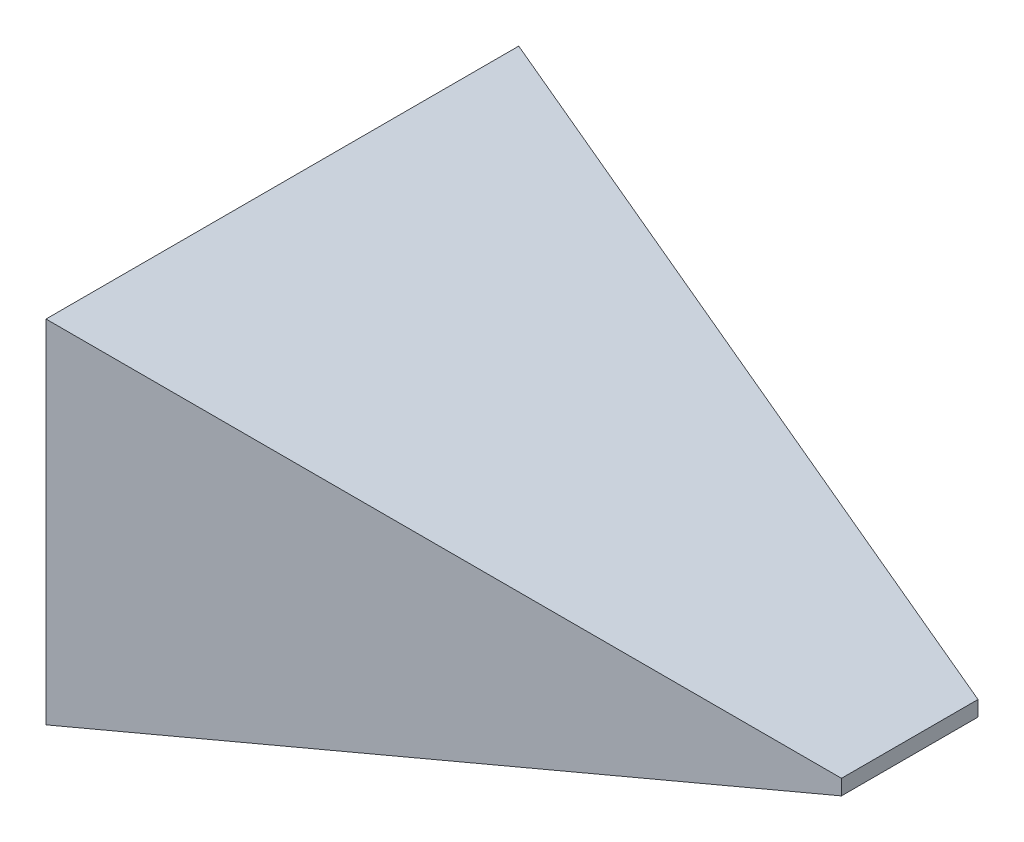
ISO-10303-21;
HEADER;
FILE_DESCRIPTION(('STEP AP214'),'2;1');
FILE_NAME('part.step','',(''),(''),'','','');
FILE_SCHEMA(('AUTOMOTIVE_DESIGN { 1 0 10303 214 1 1 1 1 }'));
ENDSEC;
DATA;
#1=APPLICATION_CONTEXT('core data for automotive mechanical design processes');
#2=APPLICATION_PROTOCOL_DEFINITION('international standard','automotive_design',2000,#1);
#3=PRODUCT_CONTEXT('',#1,'mechanical');
#4=PRODUCT('Part','Part','',(#3));
#5=PRODUCT_RELATED_PRODUCT_CATEGORY('part','',(#4));
#6=PRODUCT_DEFINITION_FORMATION('','',#4);
#7=PRODUCT_DEFINITION_CONTEXT('part definition',#1,'design');
#8=PRODUCT_DEFINITION('design','',#6,#7);
#9=PRODUCT_DEFINITION_SHAPE('','',#8);
#10=(LENGTH_UNIT() NAMED_UNIT(*) SI_UNIT(.MILLI.,.METRE.));
#11=(NAMED_UNIT(*) PLANE_ANGLE_UNIT() SI_UNIT($,.RADIAN.));
#12=(NAMED_UNIT(*) SI_UNIT($,.STERADIAN.) SOLID_ANGLE_UNIT());
#13=UNCERTAINTY_MEASURE_WITH_UNIT(LENGTH_MEASURE(1.E-05),#10,'distance_accuracy_value','');
#14=(GEOMETRIC_REPRESENTATION_CONTEXT(3) GLOBAL_UNCERTAINTY_ASSIGNED_CONTEXT((#13)) GLOBAL_UNIT_ASSIGNED_CONTEXT((#10,
#11,#12)) REPRESENTATION_CONTEXT('',''));
#15=CARTESIAN_POINT('',(0.,0.,0.));
#16=DIRECTION('',(0.,0.,1.));
#17=DIRECTION('',(1.,0.,0.));
#18=AXIS2_PLACEMENT_3D('',#15,#16,#17);
#19=CARTESIAN_POINT('',(0.,-25.4,-34.163));
#20=DIRECTION('',(0.258819045102521,0.,-0.965925826289068));
#21=DIRECTION('',(-0.965925826289068,0.,-0.258819045102521));
#22=AXIS2_PLACEMENT_3D('',#19,#20,#21);
#23=PLANE('',#22);
#24=DIRECTION('',(0.,1.,0.));
#25=VECTOR('',#24,1.);
#26=CARTESIAN_POINT('',(0.,-25.4,-34.163));
#27=LINE('',#26,#25);
#28=CARTESIAN_POINT('',(0.,-25.4,-34.163));
#29=VERTEX_POINT('',#28);
#30=CARTESIAN_POINT('',(0.,25.4,-34.163));
#31=VERTEX_POINT('',#30);
#32=EDGE_CURVE('E79',#29,#31,#27,.T.);
#33=ORIENTED_EDGE('',*,*,#32,.T.);
#34=DIRECTION('',(-0.935113126531029,0.250562807085732,-0.250562807085732));
#35=VECTOR('',#34,1.);
#36=CARTESIAN_POINT('',(16.0090940447864,21.1103761791456,-29.8733761791456));
#37=LINE('',#36,#35);
#38=CARTESIAN_POINT('',(90.6780000000001,1.10290312873057,-9.86590312873057));
#39=VERTEX_POINT('',#38);
#40=EDGE_CURVE('E11',#39,#31,#37,.T.);
#41=ORIENTED_EDGE('',*,*,#40,.F.);
#42=DIRECTION('',(0.,-1.,0.));
#43=VECTOR('',#42,1.);
#44=CARTESIAN_POINT('',(90.6780000000001,0.,-9.86590312873057));
#45=LINE('',#44,#43);
#46=CARTESIAN_POINT('',(90.6780000000001,-1.10290312873057,-9.86590312873057));
#47=VERTEX_POINT('',#46);
#48=EDGE_CURVE('E95',#47,#39,#45,.F.);
#49=ORIENTED_EDGE('',*,*,#48,.F.);
#50=DIRECTION('',(-0.935113126531029,-0.250562807085732,-0.250562807085732));
#51=VECTOR('',#50,1.);
#52=CARTESIAN_POINT('',(0.,-25.4,-34.163));
#53=LINE('',#52,#51);
#54=EDGE_CURVE('E90',#47,#29,#53,.T.);
#55=ORIENTED_EDGE('',*,*,#54,.T.);
#56=EDGE_LOOP('',(#33,#41,#49,#55));
#57=FACE_BOUND('',#56,.T.);
#58=ADVANCED_FACE('F33',(#57),#23,.T.);
#59=CARTESIAN_POINT('',(0.,25.4,34.163));
#60=DIRECTION('',(0.258819045102521,0.965925826289068,0.));
#61=DIRECTION('',(-0.965925826289068,0.258819045102521,0.));
#62=AXIS2_PLACEMENT_3D('',#59,#60,#61);
#63=PLANE('',#62);
#64=DIRECTION('',(0.,0.,1.));
#65=VECTOR('',#64,1.);
#66=CARTESIAN_POINT('',(0.,25.4,34.163));
#67=LINE('',#66,#65);
#68=CARTESIAN_POINT('',(0.,25.4,34.163));
#69=VERTEX_POINT('',#68);
#70=EDGE_CURVE('E75',#31,#69,#67,.T.);
#71=ORIENTED_EDGE('',*,*,#70,.T.);
#72=DIRECTION('',(-0.935113126531029,0.250562807085732,0.250562807085732));
#73=VECTOR('',#72,1.);
#74=CARTESIAN_POINT('',(11.9026721522576,22.2106886090302,30.9736886090302));
#75=LINE('',#74,#73);
#76=CARTESIAN_POINT('',(90.6780000000001,1.10290312873057,9.86590312873057));
#77=VERTEX_POINT('',#76);
#78=EDGE_CURVE('E42',#77,#69,#75,.T.);
#79=ORIENTED_EDGE('',*,*,#78,.F.);
#80=DIRECTION('',(0.,0.,-1.));
#81=VECTOR('',#80,1.);
#82=CARTESIAN_POINT('',(90.6780000000001,1.10290312873057,0.));
#83=LINE('',#82,#81);
#84=EDGE_CURVE('E86',#39,#77,#83,.F.);
#85=ORIENTED_EDGE('',*,*,#84,.F.);
#86=ORIENTED_EDGE('',*,*,#40,.T.);
#87=EDGE_LOOP('',(#71,#79,#85,#86));
#88=FACE_BOUND('',#87,.T.);
#89=ADVANCED_FACE('F35',(#88),#63,.T.);
#90=CARTESIAN_POINT('',(0.,-25.4,34.163));
#91=DIRECTION('',(0.258819045102521,0.,0.965925826289068));
#92=DIRECTION('',(0.965925826289068,0.,-0.258819045102521));
#93=AXIS2_PLACEMENT_3D('',#90,#91,#92);
#94=PLANE('',#93);
#95=DIRECTION('',(0.,-1.,0.));
#96=VECTOR('',#95,1.);
#97=CARTESIAN_POINT('',(0.,-25.4,34.163));
#98=LINE('',#97,#96);
#99=CARTESIAN_POINT('',(0.,-25.4,34.163));
#100=VERTEX_POINT('',#99);
#101=EDGE_CURVE('E80',#69,#100,#98,.T.);
#102=ORIENTED_EDGE('',*,*,#101,.T.);
#103=DIRECTION('',(-0.935113126531029,-0.250562807085732,0.250562807085732));
#104=VECTOR('',#103,1.);
#105=CARTESIAN_POINT('',(0.,-25.4,34.163));
#106=LINE('',#105,#104);
#107=CARTESIAN_POINT('',(90.6780000000001,-1.10290312873057,9.86590312873057));
#108=VERTEX_POINT('',#107);
#109=EDGE_CURVE('E98',#108,#100,#106,.T.);
#110=ORIENTED_EDGE('',*,*,#109,.F.);
#111=DIRECTION('',(0.,1.,0.));
#112=VECTOR('',#111,1.);
#113=CARTESIAN_POINT('',(90.6780000000001,0.,9.86590312873057));
#114=LINE('',#113,#112);
#115=EDGE_CURVE('E54',#77,#108,#114,.F.);
#116=ORIENTED_EDGE('',*,*,#115,.F.);
#117=ORIENTED_EDGE('',*,*,#78,.T.);
#118=EDGE_LOOP('',(#102,#110,#116,#117));
#119=FACE_BOUND('',#118,.T.);
#120=ADVANCED_FACE('F105',(#119),#94,.T.);
#121=CARTESIAN_POINT('',(0.,-25.4,34.163));
#122=DIRECTION('',(0.258819045102521,-0.965925826289068,0.));
#123=DIRECTION('',(0.965925826289068,0.258819045102521,0.));
#124=AXIS2_PLACEMENT_3D('',#121,#122,#123);
#125=PLANE('',#124);
#126=DIRECTION('',(0.,0.,-1.));
#127=VECTOR('',#126,1.);
#128=CARTESIAN_POINT('',(0.,-25.4,34.163));
#129=LINE('',#128,#127);
#130=EDGE_CURVE('E94',#100,#29,#129,.T.);
#131=ORIENTED_EDGE('',*,*,#130,.T.);
#132=ORIENTED_EDGE('',*,*,#54,.F.);
#133=DIRECTION('',(0.,0.,1.));
#134=VECTOR('',#133,1.);
#135=CARTESIAN_POINT('',(90.6780000000001,-1.10290312873057,0.));
#136=LINE('',#135,#134);
#137=EDGE_CURVE('E37',#108,#47,#136,.F.);
#138=ORIENTED_EDGE('',*,*,#137,.F.);
#139=ORIENTED_EDGE('',*,*,#109,.T.);
#140=EDGE_LOOP('',(#131,#132,#138,#139));
#141=FACE_BOUND('',#140,.T.);
#142=ADVANCED_FACE('F107',(#141),#125,.T.);
#143=CARTESIAN_POINT('',(90.6780000000001,0.,0.));
#144=DIRECTION('',(-1.,0.,0.));
#145=DIRECTION('',(0.,0.,1.));
#146=AXIS2_PLACEMENT_3D('',#143,#144,#145);
#147=PLANE('',#146);
#148=ORIENTED_EDGE('',*,*,#48,.T.);
#149=ORIENTED_EDGE('',*,*,#84,.T.);
#150=ORIENTED_EDGE('',*,*,#115,.T.);
#151=ORIENTED_EDGE('',*,*,#137,.T.);
#152=EDGE_LOOP('',(#148,#149,#150,#151));
#153=FACE_BOUND('',#152,.T.);
#154=ADVANCED_FACE('F103',(#153),#147,.F.);
#155=CARTESIAN_POINT('',(0.,0.,0.));
#156=DIRECTION('',(-1.,0.,0.));
#157=DIRECTION('',(0.,0.,1.));
#158=AXIS2_PLACEMENT_3D('',#155,#156,#157);
#159=PLANE('',#158);
#160=ORIENTED_EDGE('',*,*,#32,.F.);
#161=ORIENTED_EDGE('',*,*,#130,.F.);
#162=ORIENTED_EDGE('',*,*,#101,.F.);
#163=ORIENTED_EDGE('',*,*,#70,.F.);
#164=EDGE_LOOP('',(#160,#161,#162,#163));
#165=FACE_BOUND('',#164,.T.);
#166=ADVANCED_FACE('F76',(#165),#159,.T.);
#167=CLOSED_SHELL('',(#58,#89,#120,#142,#154,#166));
#168=MANIFOLD_SOLID_BREP('B2',#167);
#169=ADVANCED_BREP_SHAPE_REPRESENTATION('',(#18,#168),#14);
#170=SHAPE_DEFINITION_REPRESENTATION(#9,#169);
ENDSEC;
END-ISO-10303-21;
